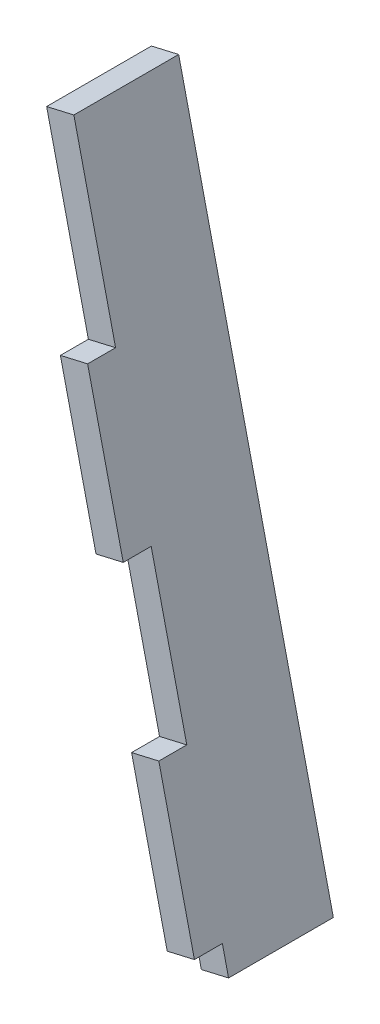
ISO-10303-21;
HEADER;
FILE_DESCRIPTION(('STEP AP214'),'2;1');
FILE_NAME('part.step','',(''),(''),'','','');
FILE_SCHEMA(('AUTOMOTIVE_DESIGN { 1 0 10303 214 1 1 1 1 }'));
ENDSEC;
DATA;
#1=APPLICATION_CONTEXT('core data for automotive mechanical design processes');
#2=APPLICATION_PROTOCOL_DEFINITION('international standard','automotive_design',2000,#1);
#3=PRODUCT_CONTEXT('',#1,'mechanical');
#4=PRODUCT('Part','Part','',(#3));
#5=PRODUCT_RELATED_PRODUCT_CATEGORY('part','',(#4));
#6=PRODUCT_DEFINITION_FORMATION('','',#4);
#7=PRODUCT_DEFINITION_CONTEXT('part definition',#1,'design');
#8=PRODUCT_DEFINITION('design','',#6,#7);
#9=PRODUCT_DEFINITION_SHAPE('','',#8);
#10=(LENGTH_UNIT() NAMED_UNIT(*) SI_UNIT(.MILLI.,.METRE.));
#11=(NAMED_UNIT(*) PLANE_ANGLE_UNIT() SI_UNIT($,.RADIAN.));
#12=(NAMED_UNIT(*) SI_UNIT($,.STERADIAN.) SOLID_ANGLE_UNIT());
#13=UNCERTAINTY_MEASURE_WITH_UNIT(LENGTH_MEASURE(1.E-05),#10,'distance_accuracy_value','');
#14=(GEOMETRIC_REPRESENTATION_CONTEXT(3) GLOBAL_UNCERTAINTY_ASSIGNED_CONTEXT((#13)) GLOBAL_UNIT_ASSIGNED_CONTEXT((#10,
#11,#12)) REPRESENTATION_CONTEXT('',''));
#15=CARTESIAN_POINT('',(0.,0.,0.));
#16=DIRECTION('',(0.,0.,1.));
#17=DIRECTION('',(1.,0.,0.));
#18=AXIS2_PLACEMENT_3D('',#15,#16,#17);
#19=CARTESIAN_POINT('',(0.,0.,-10.16));
#20=DIRECTION('',(0.,0.,1.));
#21=DIRECTION('',(1.,0.,0.));
#22=AXIS2_PLACEMENT_3D('',#19,#20,#21);
#23=PLANE('',#22);
#24=DIRECTION('',(-0.974370064785233,-0.224951054343873,0.));
#25=VECTOR('',#24,1.);
#26=CARTESIAN_POINT('',(-130.424254472527,1639.66047165468,-10.16));
#27=LINE('',#26,#25);
#28=CARTESIAN_POINT('',(-120.524654614309,1641.94597436682,-10.16));
#29=VERTEX_POINT('',#28);
#30=CARTESIAN_POINT('',(-130.424254472527,1639.66047165468,-10.16));
#31=VERTEX_POINT('',#30);
#32=EDGE_CURVE('E54',#29,#31,#27,.T.);
#33=ORIENTED_EDGE('',*,*,#32,.F.);
#34=DIRECTION('',(0.224951054343868,-0.974370064785235,0.));
#35=VECTOR('',#34,1.);
#36=CARTESIAN_POINT('',(-135.690989411794,1707.63858764344,-10.16));
#37=LINE('',#36,#35);
#38=CARTESIAN_POINT('',(-135.690989411794,1707.63858764344,-10.16));
#39=VERTEX_POINT('',#38);
#40=EDGE_CURVE('E146',#39,#29,#37,.T.);
#41=ORIENTED_EDGE('',*,*,#40,.F.);
#42=DIRECTION('',(0.974370064785233,0.224951054343876,0.));
#43=VECTOR('',#42,1.);
#44=CARTESIAN_POINT('',(-135.690989411794,1707.63858764344,-10.16));
#45=LINE('',#44,#43);
#46=CARTESIAN_POINT('',(-145.590589270012,1705.3530849313,-10.16));
#47=VERTEX_POINT('',#46);
#48=EDGE_CURVE('E148',#47,#39,#45,.T.);
#49=ORIENTED_EDGE('',*,*,#48,.F.);
#50=DIRECTION('',(-0.224951054343868,0.974370064785235,0.));
#51=VECTOR('',#50,1.);
#52=CARTESIAN_POINT('',(-145.590589270012,1705.3530849313,-10.16));
#53=LINE('',#52,#51);
#54=EDGE_CURVE('E142',#31,#47,#53,.T.);
#55=ORIENTED_EDGE('',*,*,#54,.F.);
#56=EDGE_LOOP('',(#33,#41,#49,#55));
#57=FACE_BOUND('',#56,.T.);
#58=ADVANCED_FACE('F37',(#57),#23,.T.);
#59=CARTESIAN_POINT('',(-91.6023362274834,1471.50426938285,-10.16));
#60=DIRECTION('',(-0.974370064785235,-0.224951054343868,0.));
#61=DIRECTION('',(0.224951054343868,-0.974370064785235,0.));
#62=AXIS2_PLACEMENT_3D('',#59,#60,#61);
#63=PLANE('',#62);
#64=DIRECTION('',(0.224951054343868,-0.974370064785234,0.));
#65=VECTOR('',#64,1.);
#66=CARTESIAN_POINT('',(-91.6023362274834,1471.50426938285,0.));
#67=LINE('',#66,#65);
#68=CARTESIAN_POINT('',(-104.542975642498,1527.5563368068,0.));
#69=VERTEX_POINT('',#68);
#70=CARTESIAN_POINT('',(-91.6023362274834,1471.50426938285,0.));
#71=VERTEX_POINT('',#70);
#72=EDGE_CURVE('E119',#69,#71,#67,.T.);
#73=ORIENTED_EDGE('',*,*,#72,.F.);
#74=DIRECTION('',(0.,0.,1.));
#75=VECTOR('',#74,1.);
#76=CARTESIAN_POINT('',(-104.542975642498,1527.5563368068,-10.16));
#77=LINE('',#76,#75);
#78=CARTESIAN_POINT('',(-104.542975642499,1527.5563368068,-10.16));
#79=VERTEX_POINT('',#78);
#80=EDGE_CURVE('E11',#79,#69,#77,.T.);
#81=ORIENTED_EDGE('',*,*,#80,.F.);
#82=CARTESIAN_POINT('',(-117.483615057512,1583.60840423074,-10.16));
#83=VERTEX_POINT('',#82);
#84=EDGE_CURVE('E141',#79,#83,#53,.T.);
#85=ORIENTED_EDGE('',*,*,#84,.T.);
#86=DIRECTION('',(0.,0.,1.));
#87=VECTOR('',#86,1.);
#88=CARTESIAN_POINT('',(-117.483615057512,1583.60840423074,-10.16));
#89=LINE('',#88,#87);
#90=CARTESIAN_POINT('',(-117.483615057512,1583.60840423074,0.));
#91=VERTEX_POINT('',#90);
#92=EDGE_CURVE('E183',#83,#91,#89,.T.);
#93=ORIENTED_EDGE('',*,*,#92,.T.);
#94=DIRECTION('',(0.224951054343871,-0.974370064785234,0.));
#95=VECTOR('',#94,1.);
#96=CARTESIAN_POINT('',(-130.424254472527,1639.66047165468,0.));
#97=LINE('',#96,#95);
#98=CARTESIAN_POINT('',(-130.424254472527,1639.66047165468,0.));
#99=VERTEX_POINT('',#98);
#100=EDGE_CURVE('E169',#99,#91,#97,.T.);
#101=ORIENTED_EDGE('',*,*,#100,.F.);
#102=DIRECTION('',(0.,0.,1.));
#103=VECTOR('',#102,1.);
#104=CARTESIAN_POINT('',(-130.424254472527,1639.66047165468,-10.16));
#105=LINE('',#104,#103);
#106=EDGE_CURVE('E166',#31,#99,#105,.T.);
#107=ORIENTED_EDGE('',*,*,#106,.F.);
#108=ORIENTED_EDGE('',*,*,#54,.T.);
#109=DIRECTION('',(0.,0.,1.));
#110=VECTOR('',#109,1.);
#111=CARTESIAN_POINT('',(-145.590589270012,1705.3530849313,-48.26));
#112=LINE('',#111,#110);
#113=CARTESIAN_POINT('',(-145.590589270012,1705.3530849313,-48.26));
#114=VERTEX_POINT('',#113);
#115=EDGE_CURVE('E134',#114,#47,#112,.T.);
#116=ORIENTED_EDGE('',*,*,#115,.F.);
#117=DIRECTION('',(-0.224951054343868,0.974370064785235,0.));
#118=VECTOR('',#117,1.);
#119=CARTESIAN_POINT('',(-145.590589270012,1705.3530849313,-48.26));
#120=LINE('',#119,#118);
#121=CARTESIAN_POINT('',(-89.3528256840451,1461.760568735,-48.26));
#122=VERTEX_POINT('',#121);
#123=EDGE_CURVE('E137',#122,#114,#120,.T.);
#124=ORIENTED_EDGE('',*,*,#123,.F.);
#125=DIRECTION('',(0.,0.,1.));
#126=VECTOR('',#125,1.);
#127=CARTESIAN_POINT('',(-89.3528256840451,1461.760568735,-48.26));
#128=LINE('',#127,#126);
#129=CARTESIAN_POINT('',(-89.3528256840451,1461.760568735,-10.16));
#130=VERTEX_POINT('',#129);
#131=EDGE_CURVE('E129',#122,#130,#128,.T.);
#132=ORIENTED_EDGE('',*,*,#131,.T.);
#133=CARTESIAN_POINT('',(-91.6023362274841,1471.50426938285,-10.16));
#134=VERTEX_POINT('',#133);
#135=EDGE_CURVE('E138',#130,#134,#53,.T.);
#136=ORIENTED_EDGE('',*,*,#135,.T.);
#137=DIRECTION('',(0.,0.,1.));
#138=VECTOR('',#137,1.);
#139=CARTESIAN_POINT('',(-91.6023362274834,1471.50426938285,-10.16));
#140=LINE('',#139,#138);
#141=EDGE_CURVE('E41',#134,#71,#140,.T.);
#142=ORIENTED_EDGE('',*,*,#141,.T.);
#143=EDGE_LOOP('',(#73,#81,#85,#93,#101,#107,#108,#116,#124,#132,#136,#142));
#144=FACE_BOUND('',#143,.T.);
#145=ADVANCED_FACE('F39',(#144),#63,.T.);
#146=CARTESIAN_POINT('',(-104.542975642498,1527.5563368068,-10.16));
#147=DIRECTION('',(-0.224951054343791,0.974370064785252,0.));
#148=DIRECTION('',(-0.974370064785252,-0.224951054343791,0.));
#149=AXIS2_PLACEMENT_3D('',#146,#147,#148);
#150=PLANE('',#149);
#151=DIRECTION('',(-0.974370064785252,-0.224951054343791,0.));
#152=VECTOR('',#151,1.);
#153=CARTESIAN_POINT('',(-104.542975642498,1527.5563368068,0.));
#154=LINE('',#153,#152);
#155=CARTESIAN_POINT('',(-94.6433757842798,1529.84183951893,0.));
#156=VERTEX_POINT('',#155);
#157=EDGE_CURVE('E98',#156,#69,#154,.T.);
#158=ORIENTED_EDGE('',*,*,#157,.F.);
#159=DIRECTION('',(0.,0.,1.));
#160=VECTOR('',#159,1.);
#161=CARTESIAN_POINT('',(-94.6433757842798,1529.84183951893,-10.16));
#162=LINE('',#161,#160);
#163=CARTESIAN_POINT('',(-94.6433757842804,1529.84183951893,-10.16));
#164=VERTEX_POINT('',#163);
#165=EDGE_CURVE('E46',#164,#156,#162,.T.);
#166=ORIENTED_EDGE('',*,*,#165,.F.);
#167=DIRECTION('',(-0.974370064785252,-0.224951054343791,0.));
#168=VECTOR('',#167,1.);
#169=CARTESIAN_POINT('',(-104.542975642498,1527.5563368068,-10.16));
#170=LINE('',#169,#168);
#171=EDGE_CURVE('E108',#164,#79,#170,.T.);
#172=ORIENTED_EDGE('',*,*,#171,.T.);
#173=ORIENTED_EDGE('',*,*,#80,.T.);
#174=EDGE_LOOP('',(#158,#166,#172,#173));
#175=FACE_BOUND('',#174,.T.);
#176=ADVANCED_FACE('F102',(#175),#150,.T.);
#177=CARTESIAN_POINT('',(-81.7027363692654,1473.78977209498,-10.16));
#178=DIRECTION('',(0.974370064785234,0.224951054343871,0.));
#179=DIRECTION('',(-0.224951054343871,0.974370064785234,0.));
#180=AXIS2_PLACEMENT_3D('',#177,#178,#179);
#181=PLANE('',#180);
#182=DIRECTION('',(-0.224951054343871,0.974370064785234,0.));
#183=VECTOR('',#182,1.);
#184=CARTESIAN_POINT('',(-81.7027363692654,1473.78977209498,0.));
#185=LINE('',#184,#183);
#186=CARTESIAN_POINT('',(-81.7027363692654,1473.78977209498,0.));
#187=VERTEX_POINT('',#186);
#188=EDGE_CURVE('E83',#187,#156,#185,.T.);
#189=ORIENTED_EDGE('',*,*,#188,.F.);
#190=DIRECTION('',(0.,0.,1.));
#191=VECTOR('',#190,1.);
#192=CARTESIAN_POINT('',(-81.7027363692654,1473.78977209498,-10.16));
#193=LINE('',#192,#191);
#194=CARTESIAN_POINT('',(-81.7027363692654,1473.78977209498,-10.16));
#195=VERTEX_POINT('',#194);
#196=EDGE_CURVE('E92',#195,#187,#193,.T.);
#197=ORIENTED_EDGE('',*,*,#196,.F.);
#198=CARTESIAN_POINT('',(-79.4532258258271,1464.04607144713,-10.16));
#199=VERTEX_POINT('',#198);
#200=EDGE_CURVE('E63',#195,#199,#37,.T.);
#201=ORIENTED_EDGE('',*,*,#200,.T.);
#202=DIRECTION('',(0.,0.,1.));
#203=VECTOR('',#202,1.);
#204=CARTESIAN_POINT('',(-79.4532258258271,1464.04607144713,-48.26));
#205=LINE('',#204,#203);
#206=CARTESIAN_POINT('',(-79.4532258258271,1464.04607144713,-48.26));
#207=VERTEX_POINT('',#206);
#208=EDGE_CURVE('E122',#207,#199,#205,.T.);
#209=ORIENTED_EDGE('',*,*,#208,.F.);
#210=DIRECTION('',(0.224951054343868,-0.974370064785235,0.));
#211=VECTOR('',#210,1.);
#212=CARTESIAN_POINT('',(-135.690989411794,1707.63858764344,-48.26));
#213=LINE('',#212,#211);
#214=CARTESIAN_POINT('',(-135.690989411794,1707.63858764344,-48.26));
#215=VERTEX_POINT('',#214);
#216=EDGE_CURVE('E156',#215,#207,#213,.T.);
#217=ORIENTED_EDGE('',*,*,#216,.F.);
#218=DIRECTION('',(0.,0.,1.));
#219=VECTOR('',#218,1.);
#220=CARTESIAN_POINT('',(-135.690989411794,1707.63858764344,-48.26));
#221=LINE('',#220,#219);
#222=EDGE_CURVE('E120',#215,#39,#221,.T.);
#223=ORIENTED_EDGE('',*,*,#222,.T.);
#224=ORIENTED_EDGE('',*,*,#40,.T.);
#225=DIRECTION('',(0.,0.,1.));
#226=VECTOR('',#225,1.);
#227=CARTESIAN_POINT('',(-120.524654614309,1641.94597436682,-10.16));
#228=LINE('',#227,#226);
#229=CARTESIAN_POINT('',(-120.524654614309,1641.94597436682,0.));
#230=VERTEX_POINT('',#229);
#231=EDGE_CURVE('E177',#29,#230,#228,.T.);
#232=ORIENTED_EDGE('',*,*,#231,.T.);
#233=DIRECTION('',(-0.22495105434387,0.974370064785234,0.));
#234=VECTOR('',#233,1.);
#235=CARTESIAN_POINT('',(-120.524654614309,1641.94597436682,0.));
#236=LINE('',#235,#234);
#237=CARTESIAN_POINT('',(-107.584015199294,1585.89390694287,0.));
#238=VERTEX_POINT('',#237);
#239=EDGE_CURVE('E162',#238,#230,#236,.T.);
#240=ORIENTED_EDGE('',*,*,#239,.F.);
#241=DIRECTION('',(0.,0.,1.));
#242=VECTOR('',#241,1.);
#243=CARTESIAN_POINT('',(-107.584015199294,1585.89390694287,-10.16));
#244=LINE('',#243,#242);
#245=CARTESIAN_POINT('',(-107.584015199294,1585.89390694287,-10.16));
#246=VERTEX_POINT('',#245);
#247=EDGE_CURVE('E180',#246,#238,#244,.T.);
#248=ORIENTED_EDGE('',*,*,#247,.F.);
#249=EDGE_CURVE('E87',#246,#164,#37,.T.);
#250=ORIENTED_EDGE('',*,*,#249,.T.);
#251=ORIENTED_EDGE('',*,*,#165,.T.);
#252=EDGE_LOOP('',(#189,#197,#201,#209,#217,#223,#224,#232,#240,#248,#250,#251));
#253=FACE_BOUND('',#252,.T.);
#254=ADVANCED_FACE('F82',(#253),#181,.T.);
#255=CARTESIAN_POINT('',(-91.6023362274834,1471.50426938285,-10.16));
#256=DIRECTION('',(0.224951054343896,-0.974370064785228,0.));
#257=DIRECTION('',(0.974370064785228,0.224951054343896,0.));
#258=AXIS2_PLACEMENT_3D('',#255,#256,#257);
#259=PLANE('',#258);
#260=DIRECTION('',(0.974370064785228,0.224951054343896,0.));
#261=VECTOR('',#260,1.);
#262=CARTESIAN_POINT('',(-91.6023362274834,1471.50426938285,0.));
#263=LINE('',#262,#261);
#264=EDGE_CURVE('E100',#71,#187,#263,.T.);
#265=ORIENTED_EDGE('',*,*,#264,.F.);
#266=ORIENTED_EDGE('',*,*,#141,.F.);
#267=DIRECTION('',(0.974370064785228,0.224951054343896,0.));
#268=VECTOR('',#267,1.);
#269=CARTESIAN_POINT('',(-91.6023362274834,1471.50426938285,-10.16));
#270=LINE('',#269,#268);
#271=EDGE_CURVE('E105',#134,#195,#270,.T.);
#272=ORIENTED_EDGE('',*,*,#271,.T.);
#273=ORIENTED_EDGE('',*,*,#196,.T.);
#274=EDGE_LOOP('',(#265,#266,#272,#273));
#275=FACE_BOUND('',#274,.T.);
#276=ADVANCED_FACE('F254',(#275),#259,.T.);
#277=CARTESIAN_POINT('',(0.,0.,0.));
#278=DIRECTION('',(0.,0.,-1.));
#279=DIRECTION('',(-1.,0.,0.));
#280=AXIS2_PLACEMENT_3D('',#277,#278,#279);
#281=PLANE('',#280);
#282=ORIENTED_EDGE('',*,*,#72,.T.);
#283=ORIENTED_EDGE('',*,*,#264,.T.);
#284=ORIENTED_EDGE('',*,*,#188,.T.);
#285=ORIENTED_EDGE('',*,*,#157,.T.);
#286=EDGE_LOOP('',(#282,#283,#284,#285));
#287=FACE_BOUND('',#286,.T.);
#288=ADVANCED_FACE('F97',(#287),#281,.F.);
#289=DIRECTION('',(0.974370064785233,0.224951054343874,0.));
#290=VECTOR('',#289,1.);
#291=CARTESIAN_POINT('',(-117.483615057512,1583.60840423074,-10.16));
#292=LINE('',#291,#290);
#293=EDGE_CURVE('E163',#83,#246,#292,.T.);
#294=ORIENTED_EDGE('',*,*,#293,.F.);
#295=ORIENTED_EDGE('',*,*,#84,.F.);
#296=ORIENTED_EDGE('',*,*,#171,.F.);
#297=ORIENTED_EDGE('',*,*,#249,.F.);
#298=EDGE_LOOP('',(#294,#295,#296,#297));
#299=FACE_BOUND('',#298,.T.);
#300=ADVANCED_FACE('F233',(#299),#23,.T.);
#301=ORIENTED_EDGE('',*,*,#271,.F.);
#302=ORIENTED_EDGE('',*,*,#135,.F.);
#303=DIRECTION('',(-0.974370064785232,-0.224951054343878,0.));
#304=VECTOR('',#303,1.);
#305=CARTESIAN_POINT('',(-79.4532258258271,1464.04607144713,-10.16));
#306=LINE('',#305,#304);
#307=EDGE_CURVE('E143',#199,#130,#306,.T.);
#308=ORIENTED_EDGE('',*,*,#307,.F.);
#309=ORIENTED_EDGE('',*,*,#200,.F.);
#310=EDGE_LOOP('',(#301,#302,#308,#309));
#311=FACE_BOUND('',#310,.T.);
#312=ADVANCED_FACE('F243',(#311),#23,.T.);
#313=CARTESIAN_POINT('',(-135.690989411794,1707.63858764344,-48.26));
#314=DIRECTION('',(0.224951054343876,-0.974370064785233,0.));
#315=DIRECTION('',(0.974370064785233,0.224951054343876,0.));
#316=AXIS2_PLACEMENT_3D('',#313,#314,#315);
#317=PLANE('',#316);
#318=ORIENTED_EDGE('',*,*,#48,.T.);
#319=ORIENTED_EDGE('',*,*,#222,.F.);
#320=DIRECTION('',(0.974370064785233,0.224951054343876,0.));
#321=VECTOR('',#320,1.);
#322=CARTESIAN_POINT('',(-135.690989411794,1707.63858764344,-48.26));
#323=LINE('',#322,#321);
#324=EDGE_CURVE('E140',#114,#215,#323,.T.);
#325=ORIENTED_EDGE('',*,*,#324,.F.);
#326=ORIENTED_EDGE('',*,*,#115,.T.);
#327=EDGE_LOOP('',(#318,#319,#325,#326));
#328=FACE_BOUND('',#327,.T.);
#329=ADVANCED_FACE('F240',(#328),#317,.F.);
#330=CARTESIAN_POINT('',(-79.4532258258271,1464.04607144713,-48.26));
#331=DIRECTION('',(-0.224951054343878,0.974370064785232,0.));
#332=DIRECTION('',(-0.974370064785232,-0.224951054343878,0.));
#333=AXIS2_PLACEMENT_3D('',#330,#331,#332);
#334=PLANE('',#333);
#335=ORIENTED_EDGE('',*,*,#307,.T.);
#336=ORIENTED_EDGE('',*,*,#131,.F.);
#337=DIRECTION('',(-0.974370064785232,-0.224951054343878,0.));
#338=VECTOR('',#337,1.);
#339=CARTESIAN_POINT('',(-79.4532258258271,1464.04607144713,-48.26));
#340=LINE('',#339,#338);
#341=EDGE_CURVE('E153',#207,#122,#340,.T.);
#342=ORIENTED_EDGE('',*,*,#341,.F.);
#343=ORIENTED_EDGE('',*,*,#208,.T.);
#344=EDGE_LOOP('',(#335,#336,#342,#343));
#345=FACE_BOUND('',#344,.T.);
#346=ADVANCED_FACE('F296',(#345),#334,.F.);
#347=CARTESIAN_POINT('',(0.,0.,-48.26));
#348=DIRECTION('',(0.,0.,1.));
#349=DIRECTION('',(1.,0.,0.));
#350=AXIS2_PLACEMENT_3D('',#347,#348,#349);
#351=PLANE('',#350);
#352=ORIENTED_EDGE('',*,*,#324,.T.);
#353=ORIENTED_EDGE('',*,*,#216,.T.);
#354=ORIENTED_EDGE('',*,*,#341,.T.);
#355=ORIENTED_EDGE('',*,*,#123,.T.);
#356=EDGE_LOOP('',(#352,#353,#354,#355));
#357=FACE_BOUND('',#356,.T.);
#358=ADVANCED_FACE('F305',(#357),#351,.F.);
#359=CARTESIAN_POINT('',(-130.424254472527,1639.66047165468,-10.16));
#360=DIRECTION('',(-0.224951054343873,0.974370064785233,0.));
#361=DIRECTION('',(-0.974370064785233,-0.224951054343873,0.));
#362=AXIS2_PLACEMENT_3D('',#359,#360,#361);
#363=PLANE('',#362);
#364=DIRECTION('',(-0.974370064785233,-0.224951054343873,0.));
#365=VECTOR('',#364,1.);
#366=CARTESIAN_POINT('',(-130.424254472527,1639.66047165468,0.));
#367=LINE('',#366,#365);
#368=EDGE_CURVE('E150',#230,#99,#367,.T.);
#369=ORIENTED_EDGE('',*,*,#368,.F.);
#370=ORIENTED_EDGE('',*,*,#231,.F.);
#371=ORIENTED_EDGE('',*,*,#32,.T.);
#372=ORIENTED_EDGE('',*,*,#106,.T.);
#373=EDGE_LOOP('',(#369,#370,#371,#372));
#374=FACE_BOUND('',#373,.T.);
#375=ADVANCED_FACE('F189',(#374),#363,.T.);
#376=CARTESIAN_POINT('',(-117.483615057512,1583.60840423074,-10.16));
#377=DIRECTION('',(0.224951054343874,-0.974370064785233,0.));
#378=DIRECTION('',(0.974370064785233,0.224951054343874,0.));
#379=AXIS2_PLACEMENT_3D('',#376,#377,#378);
#380=PLANE('',#379);
#381=DIRECTION('',(0.974370064785233,0.224951054343874,0.));
#382=VECTOR('',#381,1.);
#383=CARTESIAN_POINT('',(-117.483615057512,1583.60840423074,0.));
#384=LINE('',#383,#382);
#385=EDGE_CURVE('E172',#91,#238,#384,.T.);
#386=ORIENTED_EDGE('',*,*,#385,.F.);
#387=ORIENTED_EDGE('',*,*,#92,.F.);
#388=ORIENTED_EDGE('',*,*,#293,.T.);
#389=ORIENTED_EDGE('',*,*,#247,.T.);
#390=EDGE_LOOP('',(#386,#387,#388,#389));
#391=FACE_BOUND('',#390,.T.);
#392=ADVANCED_FACE('F324',(#391),#380,.T.);
#393=CARTESIAN_POINT('',(0.,0.,0.));
#394=DIRECTION('',(0.,0.,-1.));
#395=DIRECTION('',(-1.,0.,0.));
#396=AXIS2_PLACEMENT_3D('',#393,#394,#395);
#397=PLANE('',#396);
#398=ORIENTED_EDGE('',*,*,#368,.T.);
#399=ORIENTED_EDGE('',*,*,#100,.T.);
#400=ORIENTED_EDGE('',*,*,#385,.T.);
#401=ORIENTED_EDGE('',*,*,#239,.T.);
#402=EDGE_LOOP('',(#398,#399,#400,#401));
#403=FACE_BOUND('',#402,.T.);
#404=ADVANCED_FACE('F199',(#403),#397,.F.);
#405=CLOSED_SHELL('',(#58,#145,#176,#254,#276,#288,#300,#312,#329,#346,#358,#375,#392,#404));
#406=MANIFOLD_SOLID_BREP('B2',#405);
#407=ADVANCED_BREP_SHAPE_REPRESENTATION('',(#18,#406),#14);
#408=SHAPE_DEFINITION_REPRESENTATION(#9,#407);
ENDSEC;
END-ISO-10303-21;
